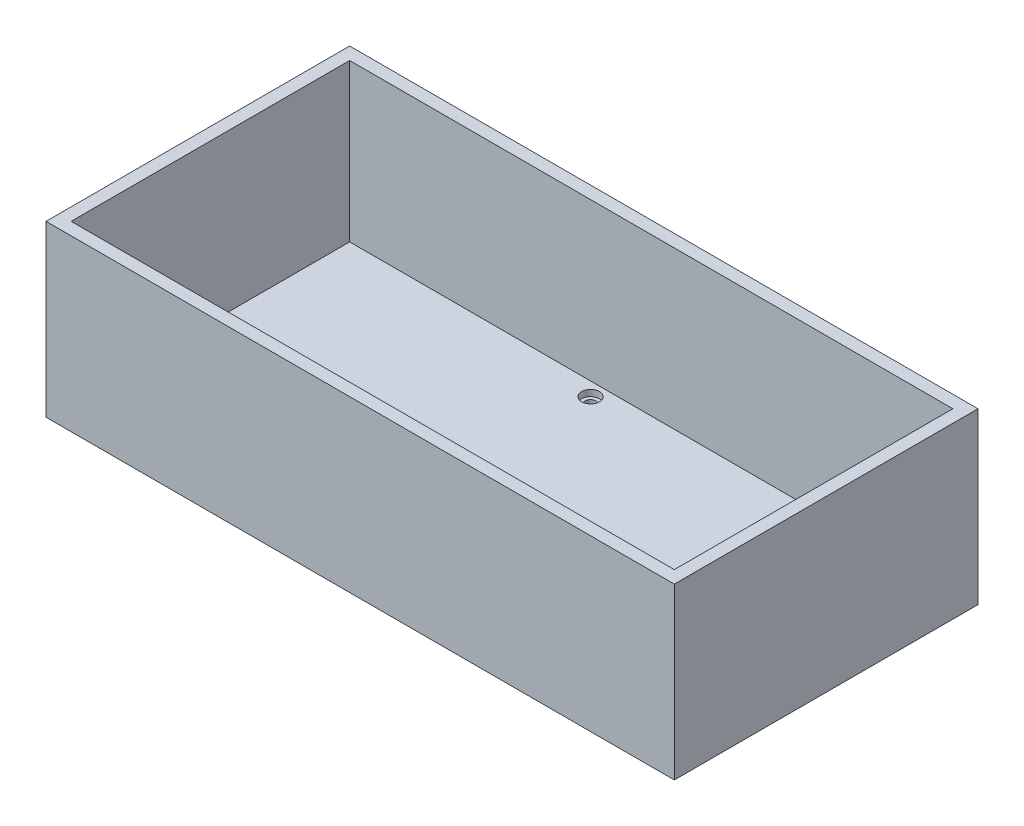
ISO-10303-21;
HEADER;
FILE_DESCRIPTION(('STEP AP214'),'2;1');
FILE_NAME('part.step','',(''),(''),'','','');
FILE_SCHEMA(('AUTOMOTIVE_DESIGN { 1 0 10303 214 1 1 1 1 }'));
ENDSEC;
DATA;
#1=APPLICATION_CONTEXT('core data for automotive mechanical design processes');
#2=APPLICATION_PROTOCOL_DEFINITION('international standard','automotive_design',2000,#1);
#3=PRODUCT_CONTEXT('',#1,'mechanical');
#4=PRODUCT('Part','Part','',(#3));
#5=PRODUCT_RELATED_PRODUCT_CATEGORY('part','',(#4));
#6=PRODUCT_DEFINITION_FORMATION('','',#4);
#7=PRODUCT_DEFINITION_CONTEXT('part definition',#1,'design');
#8=PRODUCT_DEFINITION('design','',#6,#7);
#9=PRODUCT_DEFINITION_SHAPE('','',#8);
#10=(LENGTH_UNIT() NAMED_UNIT(*) SI_UNIT(.MILLI.,.METRE.));
#11=(NAMED_UNIT(*) PLANE_ANGLE_UNIT() SI_UNIT($,.RADIAN.));
#12=(NAMED_UNIT(*) SI_UNIT($,.STERADIAN.) SOLID_ANGLE_UNIT());
#13=UNCERTAINTY_MEASURE_WITH_UNIT(LENGTH_MEASURE(1.E-05),#10,'distance_accuracy_value','');
#14=(GEOMETRIC_REPRESENTATION_CONTEXT(3) GLOBAL_UNCERTAINTY_ASSIGNED_CONTEXT((#13)) GLOBAL_UNIT_ASSIGNED_CONTEXT((#10,
#11,#12)) REPRESENTATION_CONTEXT('',''));
#15=CARTESIAN_POINT('',(0.,0.,0.));
#16=DIRECTION('',(0.,0.,1.));
#17=DIRECTION('',(1.,0.,0.));
#18=AXIS2_PLACEMENT_3D('',#15,#16,#17);
#19=CARTESIAN_POINT('',(140.,0.,-60.));
#20=DIRECTION('',(0.,1.,0.));
#21=DIRECTION('',(0.,0.,1.));
#22=AXIS2_PLACEMENT_3D('',#19,#20,#21);
#23=CYLINDRICAL_SURFACE('',#22,2.54999999999999);
#24=CARTESIAN_POINT('',(140.,0.,-60.));
#25=DIRECTION('',(0.,1.,0.));
#26=DIRECTION('',(0.,0.,1.));
#27=AXIS2_PLACEMENT_3D('',#24,#25,#26);
#28=CIRCLE('',#27,2.54999999999999);
#29=CARTESIAN_POINT('',(140.,0.,-57.45));
#30=VERTEX_POINT('',#29);
#31=EDGE_CURVE('E144',#30,#30,#28,.T.);
#32=ORIENTED_EDGE('',*,*,#31,.F.);
#33=EDGE_LOOP('',(#32));
#34=FACE_BOUND('',#33,.T.);
#35=CARTESIAN_POINT('',(140.,3.,-60.));
#36=DIRECTION('',(0.,1.,0.));
#37=DIRECTION('',(0.,0.,1.));
#38=AXIS2_PLACEMENT_3D('',#35,#36,#37);
#39=CIRCLE('',#38,2.54999999999999);
#40=CARTESIAN_POINT('',(140.,3.,-57.45));
#41=VERTEX_POINT('',#40);
#42=EDGE_CURVE('E37',#41,#41,#39,.F.);
#43=ORIENTED_EDGE('',*,*,#42,.F.);
#44=EDGE_LOOP('',(#43));
#45=FACE_BOUND('',#44,.T.);
#46=ADVANCED_FACE('F33',(#34,#45),#23,.F.);
#47=CARTESIAN_POINT('',(140.,0.,60.));
#48=DIRECTION('',(0.,1.,0.));
#49=DIRECTION('',(0.,0.,1.));
#50=AXIS2_PLACEMENT_3D('',#47,#48,#49);
#51=CYLINDRICAL_SURFACE('',#50,2.54999999999999);
#52=CARTESIAN_POINT('',(140.,0.,60.));
#53=DIRECTION('',(0.,1.,0.));
#54=DIRECTION('',(0.,0.,-1.));
#55=AXIS2_PLACEMENT_3D('',#52,#53,#54);
#56=CIRCLE('',#55,2.54999999999999);
#57=CARTESIAN_POINT('',(140.,0.,57.45));
#58=VERTEX_POINT('',#57);
#59=EDGE_CURVE('E149',#58,#58,#56,.T.);
#60=ORIENTED_EDGE('',*,*,#59,.F.);
#61=EDGE_LOOP('',(#60));
#62=FACE_BOUND('',#61,.T.);
#63=CARTESIAN_POINT('',(140.,3.,60.));
#64=DIRECTION('',(0.,1.,0.));
#65=DIRECTION('',(0.,0.,1.));
#66=AXIS2_PLACEMENT_3D('',#63,#64,#65);
#67=CIRCLE('',#66,2.54999999999999);
#68=CARTESIAN_POINT('',(140.,3.,62.55));
#69=VERTEX_POINT('',#68);
#70=EDGE_CURVE('E129',#69,#69,#67,.F.);
#71=ORIENTED_EDGE('',*,*,#70,.F.);
#72=EDGE_LOOP('',(#71));
#73=FACE_BOUND('',#72,.T.);
#74=ADVANCED_FACE('F247',(#62,#73),#51,.F.);
#75=CARTESIAN_POINT('',(-22.5000000000001,0.,60.));
#76=DIRECTION('',(0.,1.,0.));
#77=DIRECTION('',(0.,0.,1.));
#78=AXIS2_PLACEMENT_3D('',#75,#76,#77);
#79=CYLINDRICAL_SURFACE('',#78,2.54999999999999);
#80=CARTESIAN_POINT('',(-22.5000000000001,0.,60.));
#81=DIRECTION('',(0.,1.,0.));
#82=DIRECTION('',(0.,0.,1.));
#83=AXIS2_PLACEMENT_3D('',#80,#81,#82);
#84=CIRCLE('',#83,2.54999999999999);
#85=CARTESIAN_POINT('',(-22.5000000000001,0.,62.55));
#86=VERTEX_POINT('',#85);
#87=EDGE_CURVE('E153',#86,#86,#84,.T.);
#88=ORIENTED_EDGE('',*,*,#87,.F.);
#89=EDGE_LOOP('',(#88));
#90=FACE_BOUND('',#89,.T.);
#91=CARTESIAN_POINT('',(-22.5000000000001,3.,60.));
#92=DIRECTION('',(0.,1.,0.));
#93=DIRECTION('',(0.,0.,1.));
#94=AXIS2_PLACEMENT_3D('',#91,#92,#93);
#95=CIRCLE('',#94,2.54999999999999);
#96=CARTESIAN_POINT('',(-22.5000000000001,3.,62.55));
#97=VERTEX_POINT('',#96);
#98=EDGE_CURVE('E130',#97,#97,#95,.F.);
#99=ORIENTED_EDGE('',*,*,#98,.F.);
#100=EDGE_LOOP('',(#99));
#101=FACE_BOUND('',#100,.T.);
#102=ADVANCED_FACE('F249',(#90,#101),#79,.F.);
#103=CARTESIAN_POINT('',(-22.5000000000001,0.,-60.));
#104=DIRECTION('',(0.,1.,0.));
#105=DIRECTION('',(0.,0.,1.));
#106=AXIS2_PLACEMENT_3D('',#103,#104,#105);
#107=CYLINDRICAL_SURFACE('',#106,2.54999999999999);
#108=CARTESIAN_POINT('',(-22.5000000000001,0.,-60.));
#109=DIRECTION('',(0.,1.,0.));
#110=DIRECTION('',(0.,0.,-1.));
#111=AXIS2_PLACEMENT_3D('',#108,#109,#110);
#112=CIRCLE('',#111,2.54999999999999);
#113=CARTESIAN_POINT('',(-22.5000000000001,0.,-62.55));
#114=VERTEX_POINT('',#113);
#115=EDGE_CURVE('E156',#114,#114,#112,.T.);
#116=ORIENTED_EDGE('',*,*,#115,.F.);
#117=EDGE_LOOP('',(#116));
#118=FACE_BOUND('',#117,.T.);
#119=CARTESIAN_POINT('',(-22.5000000000001,3.,-60.));
#120=DIRECTION('',(0.,1.,0.));
#121=DIRECTION('',(0.,0.,1.));
#122=AXIS2_PLACEMENT_3D('',#119,#120,#121);
#123=CIRCLE('',#122,2.54999999999999);
#124=CARTESIAN_POINT('',(-22.5000000000001,3.,-57.45));
#125=VERTEX_POINT('',#124);
#126=EDGE_CURVE('E167',#125,#125,#123,.F.);
#127=ORIENTED_EDGE('',*,*,#126,.F.);
#128=EDGE_LOOP('',(#127));
#129=FACE_BOUND('',#128,.T.);
#130=ADVANCED_FACE('F256',(#118,#129),#107,.F.);
#131=CARTESIAN_POINT('',(150.,81.,-72.5));
#132=DIRECTION('',(-1.,0.,0.));
#133=DIRECTION('',(0.,0.,1.));
#134=AXIS2_PLACEMENT_3D('',#131,#132,#133);
#135=PLANE('',#134);
#136=DIRECTION('',(0.,0.,-1.));
#137=VECTOR('',#136,1.);
#138=CARTESIAN_POINT('',(150.,0.,-72.5));
#139=LINE('',#138,#137);
#140=CARTESIAN_POINT('',(150.,0.,72.5));
#141=VERTEX_POINT('',#140);
#142=CARTESIAN_POINT('',(150.,0.,-72.5));
#143=VERTEX_POINT('',#142);
#144=EDGE_CURVE('E194',#141,#143,#139,.T.);
#145=ORIENTED_EDGE('',*,*,#144,.T.);
#146=DIRECTION('',(0.,-1.,0.));
#147=VECTOR('',#146,1.);
#148=CARTESIAN_POINT('',(150.,81.,-72.5));
#149=LINE('',#148,#147);
#150=CARTESIAN_POINT('',(150.,81.,-72.5));
#151=VERTEX_POINT('',#150);
#152=EDGE_CURVE('E11',#151,#143,#149,.T.);
#153=ORIENTED_EDGE('',*,*,#152,.F.);
#154=DIRECTION('',(0.,0.,-1.));
#155=VECTOR('',#154,1.);
#156=CARTESIAN_POINT('',(150.,81.,-72.5));
#157=LINE('',#156,#155);
#158=CARTESIAN_POINT('',(150.,81.,72.5));
#159=VERTEX_POINT('',#158);
#160=EDGE_CURVE('E217',#159,#151,#157,.T.);
#161=ORIENTED_EDGE('',*,*,#160,.F.);
#162=DIRECTION('',(0.,-1.,0.));
#163=VECTOR('',#162,1.);
#164=CARTESIAN_POINT('',(150.,81.,72.5));
#165=LINE('',#164,#163);
#166=EDGE_CURVE('E226',#159,#141,#165,.T.);
#167=ORIENTED_EDGE('',*,*,#166,.T.);
#168=EDGE_LOOP('',(#145,#153,#161,#167));
#169=FACE_BOUND('',#168,.T.);
#170=ADVANCED_FACE('F35',(#169),#135,.F.);
#171=CARTESIAN_POINT('',(-150.,81.,-72.5));
#172=DIRECTION('',(0.,0.,1.));
#173=DIRECTION('',(1.,0.,0.));
#174=AXIS2_PLACEMENT_3D('',#171,#172,#173);
#175=PLANE('',#174);
#176=DIRECTION('',(-1.,0.,0.));
#177=VECTOR('',#176,1.);
#178=CARTESIAN_POINT('',(-150.,0.,-72.5));
#179=LINE('',#178,#177);
#180=CARTESIAN_POINT('',(-150.,0.,-72.5));
#181=VERTEX_POINT('',#180);
#182=EDGE_CURVE('E197',#143,#181,#179,.T.);
#183=ORIENTED_EDGE('',*,*,#182,.T.);
#184=DIRECTION('',(0.,-1.,0.));
#185=VECTOR('',#184,1.);
#186=CARTESIAN_POINT('',(-150.,81.,-72.5));
#187=LINE('',#186,#185);
#188=CARTESIAN_POINT('',(-150.,81.,-72.5));
#189=VERTEX_POINT('',#188);
#190=EDGE_CURVE('E42',#189,#181,#187,.T.);
#191=ORIENTED_EDGE('',*,*,#190,.F.);
#192=DIRECTION('',(-1.,0.,0.));
#193=VECTOR('',#192,1.);
#194=CARTESIAN_POINT('',(-150.,81.,-72.5));
#195=LINE('',#194,#193);
#196=EDGE_CURVE('E220',#151,#189,#195,.T.);
#197=ORIENTED_EDGE('',*,*,#196,.F.);
#198=ORIENTED_EDGE('',*,*,#152,.T.);
#199=EDGE_LOOP('',(#183,#191,#197,#198));
#200=FACE_BOUND('',#199,.T.);
#201=ADVANCED_FACE('F298',(#200),#175,.F.);
#202=CARTESIAN_POINT('',(-150.,81.,-72.5));
#203=DIRECTION('',(1.,0.,0.));
#204=DIRECTION('',(0.,0.,-1.));
#205=AXIS2_PLACEMENT_3D('',#202,#203,#204);
#206=PLANE('',#205);
#207=DIRECTION('',(0.,0.,1.));
#208=VECTOR('',#207,1.);
#209=CARTESIAN_POINT('',(-150.,0.,-72.5));
#210=LINE('',#209,#208);
#211=CARTESIAN_POINT('',(-150.,0.,72.5));
#212=VERTEX_POINT('',#211);
#213=EDGE_CURVE('E229',#181,#212,#210,.T.);
#214=ORIENTED_EDGE('',*,*,#213,.T.);
#215=DIRECTION('',(0.,-1.,0.));
#216=VECTOR('',#215,1.);
#217=CARTESIAN_POINT('',(-150.,81.,72.5));
#218=LINE('',#217,#216);
#219=CARTESIAN_POINT('',(-150.,81.,72.5));
#220=VERTEX_POINT('',#219);
#221=EDGE_CURVE('E234',#220,#212,#218,.T.);
#222=ORIENTED_EDGE('',*,*,#221,.F.);
#223=DIRECTION('',(0.,0.,1.));
#224=VECTOR('',#223,1.);
#225=CARTESIAN_POINT('',(-150.,81.,-72.5));
#226=LINE('',#225,#224);
#227=EDGE_CURVE('E223',#189,#220,#226,.T.);
#228=ORIENTED_EDGE('',*,*,#227,.F.);
#229=ORIENTED_EDGE('',*,*,#190,.T.);
#230=EDGE_LOOP('',(#214,#222,#228,#229));
#231=FACE_BOUND('',#230,.T.);
#232=ADVANCED_FACE('F295',(#231),#206,.F.);
#233=CARTESIAN_POINT('',(-150.,81.,72.5));
#234=DIRECTION('',(0.,0.,-1.));
#235=DIRECTION('',(-1.,0.,0.));
#236=AXIS2_PLACEMENT_3D('',#233,#234,#235);
#237=PLANE('',#236);
#238=DIRECTION('',(1.,0.,0.));
#239=VECTOR('',#238,1.);
#240=CARTESIAN_POINT('',(-150.,0.,72.5));
#241=LINE('',#240,#239);
#242=EDGE_CURVE('E221',#212,#141,#241,.T.);
#243=ORIENTED_EDGE('',*,*,#242,.T.);
#244=ORIENTED_EDGE('',*,*,#166,.F.);
#245=DIRECTION('',(1.,0.,0.));
#246=VECTOR('',#245,1.);
#247=CARTESIAN_POINT('',(-150.,81.,72.5));
#248=LINE('',#247,#246);
#249=EDGE_CURVE('E225',#220,#159,#248,.T.);
#250=ORIENTED_EDGE('',*,*,#249,.F.);
#251=ORIENTED_EDGE('',*,*,#221,.T.);
#252=EDGE_LOOP('',(#243,#244,#250,#251));
#253=FACE_BOUND('',#252,.T.);
#254=ADVANCED_FACE('F288',(#253),#237,.F.);
#255=CARTESIAN_POINT('',(0.,81.,0.));
#256=DIRECTION('',(0.,1.,0.));
#257=DIRECTION('',(0.,0.,1.));
#258=AXIS2_PLACEMENT_3D('',#255,#256,#257);
#259=PLANE('',#258);
#260=DIRECTION('',(0.,0.,-1.));
#261=VECTOR('',#260,1.);
#262=CARTESIAN_POINT('',(144.,81.,-72.5));
#263=LINE('',#262,#261);
#264=CARTESIAN_POINT('',(144.,81.,66.5));
#265=VERTEX_POINT('',#264);
#266=CARTESIAN_POINT('',(144.,81.,-66.5));
#267=VERTEX_POINT('',#266);
#268=EDGE_CURVE('E191',#265,#267,#263,.T.);
#269=ORIENTED_EDGE('',*,*,#268,.F.);
#270=DIRECTION('',(1.,0.,0.));
#271=VECTOR('',#270,1.);
#272=CARTESIAN_POINT('',(-150.,81.,66.5));
#273=LINE('',#272,#271);
#274=CARTESIAN_POINT('',(-144.,81.,66.5));
#275=VERTEX_POINT('',#274);
#276=EDGE_CURVE('E204',#275,#265,#273,.T.);
#277=ORIENTED_EDGE('',*,*,#276,.F.);
#278=DIRECTION('',(0.,0.,1.));
#279=VECTOR('',#278,1.);
#280=CARTESIAN_POINT('',(-144.,81.,-72.5));
#281=LINE('',#280,#279);
#282=CARTESIAN_POINT('',(-144.,81.,-66.5));
#283=VERTEX_POINT('',#282);
#284=EDGE_CURVE('E213',#283,#275,#281,.T.);
#285=ORIENTED_EDGE('',*,*,#284,.F.);
#286=DIRECTION('',(-1.,0.,0.));
#287=VECTOR('',#286,1.);
#288=CARTESIAN_POINT('',(-150.,81.,-66.5));
#289=LINE('',#288,#287);
#290=EDGE_CURVE('E211',#267,#283,#289,.T.);
#291=ORIENTED_EDGE('',*,*,#290,.F.);
#292=EDGE_LOOP('',(#269,#277,#285,#291));
#293=FACE_BOUND('',#292,.T.);
#294=ORIENTED_EDGE('',*,*,#160,.T.);
#295=ORIENTED_EDGE('',*,*,#196,.T.);
#296=ORIENTED_EDGE('',*,*,#227,.T.);
#297=ORIENTED_EDGE('',*,*,#249,.T.);
#298=EDGE_LOOP('',(#294,#295,#296,#297));
#299=FACE_BOUND('',#298,.T.);
#300=ADVANCED_FACE('F285',(#293,#299),#259,.T.);
#301=CARTESIAN_POINT('',(0.,0.,0.));
#302=DIRECTION('',(0.,1.,0.));
#303=DIRECTION('',(0.,0.,1.));
#304=AXIS2_PLACEMENT_3D('',#301,#302,#303);
#305=PLANE('',#304);
#306=ORIENTED_EDGE('',*,*,#115,.T.);
#307=EDGE_LOOP('',(#306));
#308=FACE_BOUND('',#307,.T.);
#309=ORIENTED_EDGE('',*,*,#87,.T.);
#310=EDGE_LOOP('',(#309));
#311=FACE_BOUND('',#310,.T.);
#312=ORIENTED_EDGE('',*,*,#59,.T.);
#313=EDGE_LOOP('',(#312));
#314=FACE_BOUND('',#313,.T.);
#315=ORIENTED_EDGE('',*,*,#31,.T.);
#316=EDGE_LOOP('',(#315));
#317=FACE_BOUND('',#316,.T.);
#318=ORIENTED_EDGE('',*,*,#144,.F.);
#319=ORIENTED_EDGE('',*,*,#242,.F.);
#320=ORIENTED_EDGE('',*,*,#213,.F.);
#321=ORIENTED_EDGE('',*,*,#182,.F.);
#322=EDGE_LOOP('',(#318,#319,#320,#321));
#323=FACE_BOUND('',#322,.T.);
#324=ADVANCED_FACE('F271',(#308,#311,#314,#317,#323),#305,.F.);
#325=CARTESIAN_POINT('',(144.,81.,-72.5));
#326=DIRECTION('',(-1.,0.,0.));
#327=DIRECTION('',(0.,0.,1.));
#328=AXIS2_PLACEMENT_3D('',#325,#326,#327);
#329=PLANE('',#328);
#330=DIRECTION('',(0.,0.,-1.));
#331=VECTOR('',#330,1.);
#332=CARTESIAN_POINT('',(144.,6.00000000000001,-72.5));
#333=LINE('',#332,#331);
#334=CARTESIAN_POINT('',(144.,6.,66.5));
#335=VERTEX_POINT('',#334);
#336=CARTESIAN_POINT('',(144.,6.,61.4361406616346));
#337=VERTEX_POINT('',#336);
#338=EDGE_CURVE('E126',#335,#337,#333,.T.);
#339=ORIENTED_EDGE('',*,*,#338,.F.);
#340=DIRECTION('',(0.,-1.,0.));
#341=VECTOR('',#340,1.);
#342=CARTESIAN_POINT('',(144.,81.,66.5));
#343=LINE('',#342,#341);
#344=EDGE_CURVE('E203',#265,#335,#343,.T.);
#345=ORIENTED_EDGE('',*,*,#344,.F.);
#346=ORIENTED_EDGE('',*,*,#268,.T.);
#347=DIRECTION('',(0.,-1.,0.));
#348=VECTOR('',#347,1.);
#349=CARTESIAN_POINT('',(144.,81.,-66.5));
#350=LINE('',#349,#348);
#351=CARTESIAN_POINT('',(144.,6.,-66.5));
#352=VERTEX_POINT('',#351);
#353=EDGE_CURVE('E189',#267,#352,#350,.T.);
#354=ORIENTED_EDGE('',*,*,#353,.T.);
#355=CARTESIAN_POINT('',(144.,6.,-61.4361406616346));
#356=VERTEX_POINT('',#355);
#357=EDGE_CURVE('E139',#356,#352,#333,.T.);
#358=ORIENTED_EDGE('',*,*,#357,.F.);
#359=DIRECTION('',(0.,0.,-1.));
#360=VECTOR('',#359,1.);
#361=CARTESIAN_POINT('',(144.,6.00000000000001,-72.5));
#362=LINE('',#361,#360);
#363=CARTESIAN_POINT('',(144.,6.,-58.5638593383654));
#364=VERTEX_POINT('',#363);
#365=EDGE_CURVE('E161',#364,#356,#362,.T.);
#366=ORIENTED_EDGE('',*,*,#365,.F.);
#367=CARTESIAN_POINT('',(144.,6.,58.5638593383654));
#368=VERTEX_POINT('',#367);
#369=EDGE_CURVE('E128',#368,#364,#333,.T.);
#370=ORIENTED_EDGE('',*,*,#369,.F.);
#371=DIRECTION('',(0.,0.,-1.));
#372=VECTOR('',#371,1.);
#373=CARTESIAN_POINT('',(144.,6.00000000000001,-72.5));
#374=LINE('',#373,#372);
#375=EDGE_CURVE('E120',#337,#368,#374,.T.);
#376=ORIENTED_EDGE('',*,*,#375,.F.);
#377=EDGE_LOOP('',(#339,#345,#346,#354,#358,#366,#370,#376));
#378=FACE_BOUND('',#377,.T.);
#379=ADVANCED_FACE('F124',(#378),#329,.T.);
#380=CARTESIAN_POINT('',(-150.,81.,-66.5));
#381=DIRECTION('',(0.,0.,1.));
#382=DIRECTION('',(1.,0.,0.));
#383=AXIS2_PLACEMENT_3D('',#380,#381,#382);
#384=PLANE('',#383);
#385=DIRECTION('',(-1.,0.,0.));
#386=VECTOR('',#385,1.);
#387=CARTESIAN_POINT('',(-150.,6.00000000000001,-66.5));
#388=LINE('',#387,#386);
#389=CARTESIAN_POINT('',(-144.,6.,-66.5));
#390=VERTEX_POINT('',#389);
#391=EDGE_CURVE('E137',#352,#390,#388,.T.);
#392=ORIENTED_EDGE('',*,*,#391,.F.);
#393=ORIENTED_EDGE('',*,*,#353,.F.);
#394=ORIENTED_EDGE('',*,*,#290,.T.);
#395=DIRECTION('',(0.,-1.,0.));
#396=VECTOR('',#395,1.);
#397=CARTESIAN_POINT('',(-144.,81.,-66.5));
#398=LINE('',#397,#396);
#399=EDGE_CURVE('E195',#283,#390,#398,.T.);
#400=ORIENTED_EDGE('',*,*,#399,.T.);
#401=EDGE_LOOP('',(#392,#393,#394,#400));
#402=FACE_BOUND('',#401,.T.);
#403=ADVANCED_FACE('F270',(#402),#384,.T.);
#404=CARTESIAN_POINT('',(-144.,81.,-72.5));
#405=DIRECTION('',(1.,0.,0.));
#406=DIRECTION('',(0.,0.,-1.));
#407=AXIS2_PLACEMENT_3D('',#404,#405,#406);
#408=PLANE('',#407);
#409=DIRECTION('',(0.,0.,1.));
#410=VECTOR('',#409,1.);
#411=CARTESIAN_POINT('',(-144.,6.00000000000001,-72.5));
#412=LINE('',#411,#410);
#413=CARTESIAN_POINT('',(-144.,6.,66.5));
#414=VERTEX_POINT('',#413);
#415=EDGE_CURVE('E140',#390,#414,#412,.T.);
#416=ORIENTED_EDGE('',*,*,#415,.F.);
#417=ORIENTED_EDGE('',*,*,#399,.F.);
#418=ORIENTED_EDGE('',*,*,#284,.T.);
#419=DIRECTION('',(0.,-1.,0.));
#420=VECTOR('',#419,1.);
#421=CARTESIAN_POINT('',(-144.,81.,66.5));
#422=LINE('',#421,#420);
#423=EDGE_CURVE('E200',#275,#414,#422,.T.);
#424=ORIENTED_EDGE('',*,*,#423,.T.);
#425=EDGE_LOOP('',(#416,#417,#418,#424));
#426=FACE_BOUND('',#425,.T.);
#427=ADVANCED_FACE('F274',(#426),#408,.T.);
#428=CARTESIAN_POINT('',(-150.,81.,66.5));
#429=DIRECTION('',(0.,0.,-1.));
#430=DIRECTION('',(-1.,0.,0.));
#431=AXIS2_PLACEMENT_3D('',#428,#429,#430);
#432=PLANE('',#431);
#433=DIRECTION('',(1.,0.,0.));
#434=VECTOR('',#433,1.);
#435=CARTESIAN_POINT('',(-150.,6.00000000000001,66.5));
#436=LINE('',#435,#434);
#437=EDGE_CURVE('E135',#414,#335,#436,.T.);
#438=ORIENTED_EDGE('',*,*,#437,.F.);
#439=ORIENTED_EDGE('',*,*,#423,.F.);
#440=ORIENTED_EDGE('',*,*,#276,.T.);
#441=ORIENTED_EDGE('',*,*,#344,.T.);
#442=EDGE_LOOP('',(#438,#439,#440,#441));
#443=FACE_BOUND('',#442,.T.);
#444=ADVANCED_FACE('F277',(#443),#432,.T.);
#445=CARTESIAN_POINT('',(0.,6.,0.));
#446=DIRECTION('',(0.,1.,0.));
#447=DIRECTION('',(0.,0.,1.));
#448=AXIS2_PLACEMENT_3D('',#445,#446,#447);
#449=PLANE('',#448);
#450=CARTESIAN_POINT('',(140.,6.,60.));
#451=DIRECTION('',(0.,1.,0.));
#452=DIRECTION('',(0.,0.,1.));
#453=AXIS2_PLACEMENT_3D('',#450,#451,#452);
#454=CIRCLE('',#453,4.25000000000001);
#455=EDGE_CURVE('E110',#368,#337,#454,.T.);
#456=ORIENTED_EDGE('',*,*,#455,.F.);
#457=ORIENTED_EDGE('',*,*,#369,.T.);
#458=CARTESIAN_POINT('',(140.,6.,-60.));
#459=DIRECTION('',(0.,1.,0.));
#460=DIRECTION('',(0.,0.,1.));
#461=AXIS2_PLACEMENT_3D('',#458,#459,#460);
#462=CIRCLE('',#461,4.25000000000001);
#463=EDGE_CURVE('E165',#356,#364,#462,.T.);
#464=ORIENTED_EDGE('',*,*,#463,.F.);
#465=ORIENTED_EDGE('',*,*,#357,.T.);
#466=ORIENTED_EDGE('',*,*,#391,.T.);
#467=ORIENTED_EDGE('',*,*,#415,.T.);
#468=ORIENTED_EDGE('',*,*,#437,.T.);
#469=ORIENTED_EDGE('',*,*,#338,.T.);
#470=EDGE_LOOP('',(#456,#457,#464,#465,#466,#467,#468,#469));
#471=FACE_BOUND('',#470,.T.);
#472=CARTESIAN_POINT('',(-22.5000000000001,6.,60.));
#473=DIRECTION('',(0.,1.,0.));
#474=DIRECTION('',(0.,0.,1.));
#475=AXIS2_PLACEMENT_3D('',#472,#473,#474);
#476=CIRCLE('',#475,4.25);
#477=CARTESIAN_POINT('',(-22.5000000000001,6.,64.25));
#478=VERTEX_POINT('',#477);
#479=EDGE_CURVE('E171',#478,#478,#476,.T.);
#480=ORIENTED_EDGE('',*,*,#479,.F.);
#481=EDGE_LOOP('',(#480));
#482=FACE_BOUND('',#481,.T.);
#483=CARTESIAN_POINT('',(-22.5000000000001,6.,-60.));
#484=DIRECTION('',(0.,1.,0.));
#485=DIRECTION('',(0.,0.,1.));
#486=AXIS2_PLACEMENT_3D('',#483,#484,#485);
#487=CIRCLE('',#486,4.25);
#488=CARTESIAN_POINT('',(-22.5000000000001,6.,-55.75));
#489=VERTEX_POINT('',#488);
#490=EDGE_CURVE('E177',#489,#489,#487,.T.);
#491=ORIENTED_EDGE('',*,*,#490,.F.);
#492=EDGE_LOOP('',(#491));
#493=FACE_BOUND('',#492,.T.);
#494=ADVANCED_FACE('F132',(#471,#482,#493),#449,.T.);
#495=CARTESIAN_POINT('',(-22.5000000000001,3.,-60.));
#496=DIRECTION('',(0.,1.,0.));
#497=DIRECTION('',(0.,0.,1.));
#498=AXIS2_PLACEMENT_3D('',#495,#496,#497);
#499=PLANE('',#498);
#500=CARTESIAN_POINT('',(-22.5000000000001,3.,-60.));
#501=DIRECTION('',(0.,1.,0.));
#502=DIRECTION('',(0.,0.,1.));
#503=AXIS2_PLACEMENT_3D('',#500,#501,#502);
#504=CIRCLE('',#503,4.25);
#505=CARTESIAN_POINT('',(-22.5000000000001,3.,-55.75));
#506=VERTEX_POINT('',#505);
#507=EDGE_CURVE('E180',#506,#506,#504,.T.);
#508=ORIENTED_EDGE('',*,*,#507,.T.);
#509=EDGE_LOOP('',(#508));
#510=FACE_BOUND('',#509,.T.);
#511=ORIENTED_EDGE('',*,*,#126,.T.);
#512=EDGE_LOOP('',(#511));
#513=FACE_BOUND('',#512,.T.);
#514=ADVANCED_FACE('F284',(#510,#513),#499,.T.);
#515=CARTESIAN_POINT('',(-22.5000000000001,3.,-60.));
#516=DIRECTION('',(0.,1.,0.));
#517=DIRECTION('',(0.,0.,1.));
#518=AXIS2_PLACEMENT_3D('',#515,#516,#517);
#519=CYLINDRICAL_SURFACE('',#518,4.25);
#520=ORIENTED_EDGE('',*,*,#507,.F.);
#521=EDGE_LOOP('',(#520));
#522=FACE_BOUND('',#521,.T.);
#523=ORIENTED_EDGE('',*,*,#490,.T.);
#524=EDGE_LOOP('',(#523));
#525=FACE_BOUND('',#524,.T.);
#526=ADVANCED_FACE('F407',(#522,#525),#519,.F.);
#527=CARTESIAN_POINT('',(-22.5000000000001,3.,60.));
#528=DIRECTION('',(0.,1.,0.));
#529=DIRECTION('',(0.,0.,1.));
#530=AXIS2_PLACEMENT_3D('',#527,#528,#529);
#531=PLANE('',#530);
#532=CARTESIAN_POINT('',(-22.5000000000001,3.,60.));
#533=DIRECTION('',(0.,1.,0.));
#534=DIRECTION('',(0.,0.,1.));
#535=AXIS2_PLACEMENT_3D('',#532,#533,#534);
#536=CIRCLE('',#535,4.25);
#537=CARTESIAN_POINT('',(-22.5000000000001,3.,64.25));
#538=VERTEX_POINT('',#537);
#539=EDGE_CURVE('E174',#538,#538,#536,.T.);
#540=ORIENTED_EDGE('',*,*,#539,.T.);
#541=EDGE_LOOP('',(#540));
#542=FACE_BOUND('',#541,.T.);
#543=ORIENTED_EDGE('',*,*,#98,.T.);
#544=EDGE_LOOP('',(#543));
#545=FACE_BOUND('',#544,.T.);
#546=ADVANCED_FACE('F416',(#542,#545),#531,.T.);
#547=CARTESIAN_POINT('',(-22.5000000000001,3.,60.));
#548=DIRECTION('',(0.,1.,0.));
#549=DIRECTION('',(0.,0.,1.));
#550=AXIS2_PLACEMENT_3D('',#547,#548,#549);
#551=CYLINDRICAL_SURFACE('',#550,4.25);
#552=ORIENTED_EDGE('',*,*,#539,.F.);
#553=EDGE_LOOP('',(#552));
#554=FACE_BOUND('',#553,.T.);
#555=ORIENTED_EDGE('',*,*,#479,.T.);
#556=EDGE_LOOP('',(#555));
#557=FACE_BOUND('',#556,.T.);
#558=ADVANCED_FACE('F426',(#554,#557),#551,.F.);
#559=CARTESIAN_POINT('',(140.,3.,60.));
#560=DIRECTION('',(0.,1.,0.));
#561=DIRECTION('',(0.,0.,1.));
#562=AXIS2_PLACEMENT_3D('',#559,#560,#561);
#563=PLANE('',#562);
#564=CARTESIAN_POINT('',(140.,3.,60.));
#565=DIRECTION('',(0.,1.,0.));
#566=DIRECTION('',(0.,0.,1.));
#567=AXIS2_PLACEMENT_3D('',#564,#565,#566);
#568=CIRCLE('',#567,4.25000000000001);
#569=CARTESIAN_POINT('',(140.,3.,64.25));
#570=VERTEX_POINT('',#569);
#571=EDGE_CURVE('E121',#570,#570,#568,.T.);
#572=ORIENTED_EDGE('',*,*,#571,.T.);
#573=EDGE_LOOP('',(#572));
#574=FACE_BOUND('',#573,.T.);
#575=ORIENTED_EDGE('',*,*,#70,.T.);
#576=EDGE_LOOP('',(#575));
#577=FACE_BOUND('',#576,.T.);
#578=ADVANCED_FACE('F245',(#574,#577),#563,.T.);
#579=CARTESIAN_POINT('',(140.,6.,60.));
#580=DIRECTION('',(0.,1.,0.));
#581=DIRECTION('',(0.,0.,1.));
#582=AXIS2_PLACEMENT_3D('',#579,#580,#581);
#583=PLANE('',#582);
#584=ORIENTED_EDGE('',*,*,#375,.T.);
#585=EDGE_CURVE('E56',#337,#368,#454,.T.);
#586=ORIENTED_EDGE('',*,*,#585,.F.);
#587=EDGE_LOOP('',(#584,#586));
#588=FACE_BOUND('',#587,.T.);
#589=ADVANCED_FACE('F119',(#588),#583,.F.);
#590=CARTESIAN_POINT('',(140.,3.,60.));
#591=DIRECTION('',(0.,1.,0.));
#592=DIRECTION('',(0.,0.,1.));
#593=AXIS2_PLACEMENT_3D('',#590,#591,#592);
#594=CYLINDRICAL_SURFACE('',#593,4.25000000000001);
#595=ORIENTED_EDGE('',*,*,#571,.F.);
#596=EDGE_LOOP('',(#595));
#597=FACE_BOUND('',#596,.T.);
#598=ORIENTED_EDGE('',*,*,#585,.T.);
#599=ORIENTED_EDGE('',*,*,#455,.T.);
#600=EDGE_LOOP('',(#598,#599));
#601=FACE_BOUND('',#600,.T.);
#602=ADVANCED_FACE('F111',(#597,#601),#594,.F.);
#603=CARTESIAN_POINT('',(140.,3.,-60.));
#604=DIRECTION('',(0.,1.,0.));
#605=DIRECTION('',(0.,0.,1.));
#606=AXIS2_PLACEMENT_3D('',#603,#604,#605);
#607=PLANE('',#606);
#608=CARTESIAN_POINT('',(140.,3.,-60.));
#609=DIRECTION('',(0.,1.,0.));
#610=DIRECTION('',(0.,0.,1.));
#611=AXIS2_PLACEMENT_3D('',#608,#609,#610);
#612=CIRCLE('',#611,4.25000000000001);
#613=CARTESIAN_POINT('',(140.,3.,-55.75));
#614=VERTEX_POINT('',#613);
#615=EDGE_CURVE('E164',#614,#614,#612,.T.);
#616=ORIENTED_EDGE('',*,*,#615,.T.);
#617=EDGE_LOOP('',(#616));
#618=FACE_BOUND('',#617,.T.);
#619=ORIENTED_EDGE('',*,*,#42,.T.);
#620=EDGE_LOOP('',(#619));
#621=FACE_BOUND('',#620,.T.);
#622=ADVANCED_FACE('F462',(#618,#621),#607,.T.);
#623=CARTESIAN_POINT('',(140.,6.,-60.));
#624=DIRECTION('',(0.,1.,0.));
#625=DIRECTION('',(0.,0.,1.));
#626=AXIS2_PLACEMENT_3D('',#623,#624,#625);
#627=PLANE('',#626);
#628=ORIENTED_EDGE('',*,*,#365,.T.);
#629=EDGE_CURVE('E49',#364,#356,#462,.T.);
#630=ORIENTED_EDGE('',*,*,#629,.F.);
#631=EDGE_LOOP('',(#628,#630));
#632=FACE_BOUND('',#631,.T.);
#633=ADVANCED_FACE('F186',(#632),#627,.F.);
#634=CARTESIAN_POINT('',(140.,3.,-60.));
#635=DIRECTION('',(0.,1.,0.));
#636=DIRECTION('',(0.,0.,1.));
#637=AXIS2_PLACEMENT_3D('',#634,#635,#636);
#638=CYLINDRICAL_SURFACE('',#637,4.25000000000001);
#639=ORIENTED_EDGE('',*,*,#615,.F.);
#640=EDGE_LOOP('',(#639));
#641=FACE_BOUND('',#640,.T.);
#642=ORIENTED_EDGE('',*,*,#629,.T.);
#643=ORIENTED_EDGE('',*,*,#463,.T.);
#644=EDGE_LOOP('',(#642,#643));
#645=FACE_BOUND('',#644,.T.);
#646=ADVANCED_FACE('F184',(#641,#645),#638,.F.);
#647=CLOSED_SHELL('',(#46,#74,#102,#130,#170,#201,#232,#254,#300,#324,#379,#403,#427,#444,#494,
#514,#526,#546,#558,#578,#589,#602,#622,#633,#646));
#648=MANIFOLD_SOLID_BREP('B2',#647);
#649=ADVANCED_BREP_SHAPE_REPRESENTATION('',(#18,#648),#14);
#650=SHAPE_DEFINITION_REPRESENTATION(#9,#649);
ENDSEC;
END-ISO-10303-21;
